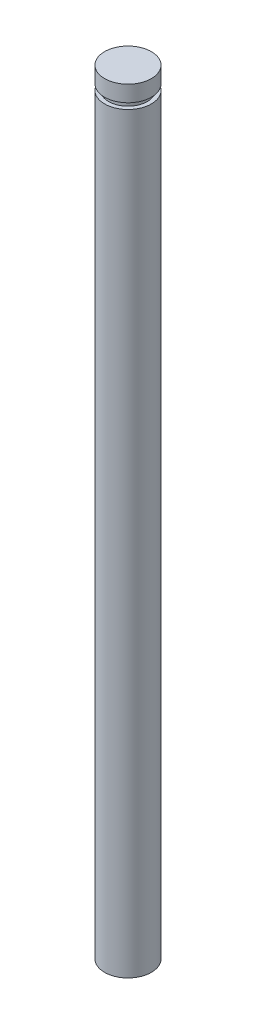
ISO-10303-21;
HEADER;
FILE_DESCRIPTION(('STEP AP214'),'2;1');
FILE_NAME('part.step','',(''),(''),'','','');
FILE_SCHEMA(('AUTOMOTIVE_DESIGN { 1 0 10303 214 1 1 1 1 }'));
ENDSEC;
DATA;
#1=APPLICATION_CONTEXT('core data for automotive mechanical design processes');
#2=APPLICATION_PROTOCOL_DEFINITION('international standard','automotive_design',2000,#1);
#3=PRODUCT_CONTEXT('',#1,'mechanical');
#4=PRODUCT('Part','Part','',(#3));
#5=PRODUCT_RELATED_PRODUCT_CATEGORY('part','',(#4));
#6=PRODUCT_DEFINITION_FORMATION('','',#4);
#7=PRODUCT_DEFINITION_CONTEXT('part definition',#1,'design');
#8=PRODUCT_DEFINITION('design','',#6,#7);
#9=PRODUCT_DEFINITION_SHAPE('','',#8);
#10=(LENGTH_UNIT() NAMED_UNIT(*) SI_UNIT(.MILLI.,.METRE.));
#11=(NAMED_UNIT(*) PLANE_ANGLE_UNIT() SI_UNIT($,.RADIAN.));
#12=(NAMED_UNIT(*) SI_UNIT($,.STERADIAN.) SOLID_ANGLE_UNIT());
#13=UNCERTAINTY_MEASURE_WITH_UNIT(LENGTH_MEASURE(1.E-05),#10,'distance_accuracy_value','');
#14=(GEOMETRIC_REPRESENTATION_CONTEXT(3) GLOBAL_UNCERTAINTY_ASSIGNED_CONTEXT((#13)) GLOBAL_UNIT_ASSIGNED_CONTEXT((#10,
#11,#12)) REPRESENTATION_CONTEXT('',''));
#15=CARTESIAN_POINT('',(0.,0.,0.));
#16=DIRECTION('',(0.,0.,1.));
#17=DIRECTION('',(1.,0.,0.));
#18=AXIS2_PLACEMENT_3D('',#15,#16,#17);
#19=CARTESIAN_POINT('',(0.,23.32,0.));
#20=DIRECTION('',(0.,-1.,0.));
#21=DIRECTION('',(0.,0.,-1.));
#22=AXIS2_PLACEMENT_3D('',#19,#20,#21);
#23=CYLINDRICAL_SURFACE('',#22,0.725);
#24=CARTESIAN_POINT('',(0.,23.32,0.));
#25=DIRECTION('',(0.,1.,0.));
#26=DIRECTION('',(0.,0.,1.));
#27=AXIS2_PLACEMENT_3D('',#24,#25,#26);
#28=CIRCLE('',#27,0.725);
#29=CARTESIAN_POINT('',(0.,23.32,0.725));
#30=VERTEX_POINT('',#29);
#31=EDGE_CURVE('E10',#30,#30,#28,.T.);
#32=ORIENTED_EDGE('',*,*,#31,.F.);
#33=EDGE_LOOP('',(#32));
#34=FACE_BOUND('',#33,.T.);
#35=CARTESIAN_POINT('',(0.,0.,0.));
#36=DIRECTION('',(0.,1.,0.));
#37=DIRECTION('',(0.,0.,1.));
#38=AXIS2_PLACEMENT_3D('',#35,#36,#37);
#39=CIRCLE('',#38,0.725);
#40=CARTESIAN_POINT('',(0.,0.,0.725));
#41=VERTEX_POINT('',#40);
#42=EDGE_CURVE('E33',#41,#41,#39,.T.);
#43=ORIENTED_EDGE('',*,*,#42,.T.);
#44=EDGE_LOOP('',(#43));
#45=FACE_BOUND('',#44,.T.);
#46=ADVANCED_FACE('F30',(#34,#45),#23,.T.);
#47=CARTESIAN_POINT('',(0.,23.32,0.));
#48=DIRECTION('',(0.,1.,0.));
#49=DIRECTION('',(0.,0.,1.));
#50=AXIS2_PLACEMENT_3D('',#47,#48,#49);
#51=PLANE('',#50);
#52=CARTESIAN_POINT('',(0.,23.32,0.));
#53=DIRECTION('',(0.,1.,0.));
#54=DIRECTION('',(0.,0.,1.));
#55=AXIS2_PLACEMENT_3D('',#52,#53,#54);
#56=CIRCLE('',#55,0.6);
#57=CARTESIAN_POINT('',(0.,23.32,0.6));
#58=VERTEX_POINT('',#57);
#59=EDGE_CURVE('E42',#58,#58,#56,.T.);
#60=ORIENTED_EDGE('',*,*,#59,.F.);
#61=EDGE_LOOP('',(#60));
#62=FACE_BOUND('',#61,.T.);
#63=ORIENTED_EDGE('',*,*,#31,.T.);
#64=EDGE_LOOP('',(#63));
#65=FACE_BOUND('',#64,.T.);
#66=ADVANCED_FACE('F72',(#62,#65),#51,.T.);
#67=CARTESIAN_POINT('',(0.,0.,0.));
#68=DIRECTION('',(0.,1.,0.));
#69=DIRECTION('',(0.,0.,1.));
#70=AXIS2_PLACEMENT_3D('',#67,#68,#69);
#71=PLANE('',#70);
#72=ORIENTED_EDGE('',*,*,#42,.F.);
#73=EDGE_LOOP('',(#72));
#74=FACE_BOUND('',#73,.T.);
#75=ADVANCED_FACE('F77',(#74),#71,.F.);
#76=CARTESIAN_POINT('',(0.,23.5,0.));
#77=DIRECTION('',(0.,-1.,0.));
#78=DIRECTION('',(0.,0.,-1.));
#79=AXIS2_PLACEMENT_3D('',#76,#77,#78);
#80=CYLINDRICAL_SURFACE('',#79,0.6);
#81=CARTESIAN_POINT('',(0.,23.5,0.));
#82=DIRECTION('',(0.,1.,0.));
#83=DIRECTION('',(0.,0.,1.));
#84=AXIS2_PLACEMENT_3D('',#81,#82,#83);
#85=CIRCLE('',#84,0.6);
#86=CARTESIAN_POINT('',(0.,23.5,0.6));
#87=VERTEX_POINT('',#86);
#88=EDGE_CURVE('E40',#87,#87,#85,.T.);
#89=ORIENTED_EDGE('',*,*,#88,.F.);
#90=EDGE_LOOP('',(#89));
#91=FACE_BOUND('',#90,.T.);
#92=ORIENTED_EDGE('',*,*,#59,.T.);
#93=EDGE_LOOP('',(#92));
#94=FACE_BOUND('',#93,.T.);
#95=ADVANCED_FACE('F59',(#91,#94),#80,.T.);
#96=CARTESIAN_POINT('',(0.,24.,0.));
#97=DIRECTION('',(0.,-1.,0.));
#98=DIRECTION('',(0.,0.,-1.));
#99=AXIS2_PLACEMENT_3D('',#96,#97,#98);
#100=CYLINDRICAL_SURFACE('',#99,0.725);
#101=CARTESIAN_POINT('',(0.,24.,0.));
#102=DIRECTION('',(0.,1.,0.));
#103=DIRECTION('',(0.,0.,1.));
#104=AXIS2_PLACEMENT_3D('',#101,#102,#103);
#105=CIRCLE('',#104,0.725);
#106=CARTESIAN_POINT('',(0.,24.,0.725));
#107=VERTEX_POINT('',#106);
#108=EDGE_CURVE('E45',#107,#107,#105,.T.);
#109=ORIENTED_EDGE('',*,*,#108,.F.);
#110=EDGE_LOOP('',(#109));
#111=FACE_BOUND('',#110,.T.);
#112=CARTESIAN_POINT('',(0.,23.5,0.));
#113=DIRECTION('',(0.,1.,0.));
#114=DIRECTION('',(0.,0.,1.));
#115=AXIS2_PLACEMENT_3D('',#112,#113,#114);
#116=CIRCLE('',#115,0.725);
#117=CARTESIAN_POINT('',(0.,23.5,0.725));
#118=VERTEX_POINT('',#117);
#119=EDGE_CURVE('E48',#118,#118,#116,.T.);
#120=ORIENTED_EDGE('',*,*,#119,.T.);
#121=EDGE_LOOP('',(#120));
#122=FACE_BOUND('',#121,.T.);
#123=ADVANCED_FACE('F56',(#111,#122),#100,.T.);
#124=CARTESIAN_POINT('',(0.,24.,0.));
#125=DIRECTION('',(0.,1.,0.));
#126=DIRECTION('',(0.,0.,1.));
#127=AXIS2_PLACEMENT_3D('',#124,#125,#126);
#128=PLANE('',#127);
#129=ORIENTED_EDGE('',*,*,#108,.T.);
#130=EDGE_LOOP('',(#129));
#131=FACE_BOUND('',#130,.T.);
#132=ADVANCED_FACE('F54',(#131),#128,.T.);
#133=CARTESIAN_POINT('',(0.,23.5,0.));
#134=DIRECTION('',(0.,1.,0.));
#135=DIRECTION('',(0.,0.,1.));
#136=AXIS2_PLACEMENT_3D('',#133,#134,#135);
#137=PLANE('',#136);
#138=ORIENTED_EDGE('',*,*,#88,.T.);
#139=EDGE_LOOP('',(#138));
#140=FACE_BOUND('',#139,.T.);
#141=ORIENTED_EDGE('',*,*,#119,.F.);
#142=EDGE_LOOP('',(#141));
#143=FACE_BOUND('',#142,.T.);
#144=ADVANCED_FACE('F63',(#140,#143),#137,.F.);
#145=CLOSED_SHELL('',(#46,#66,#75,#95,#123,#132,#144));
#146=MANIFOLD_SOLID_BREP('B2',#145);
#147=ADVANCED_BREP_SHAPE_REPRESENTATION('',(#18,#146),#14);
#148=SHAPE_DEFINITION_REPRESENTATION(#9,#147);
ENDSEC;
END-ISO-10303-21;
